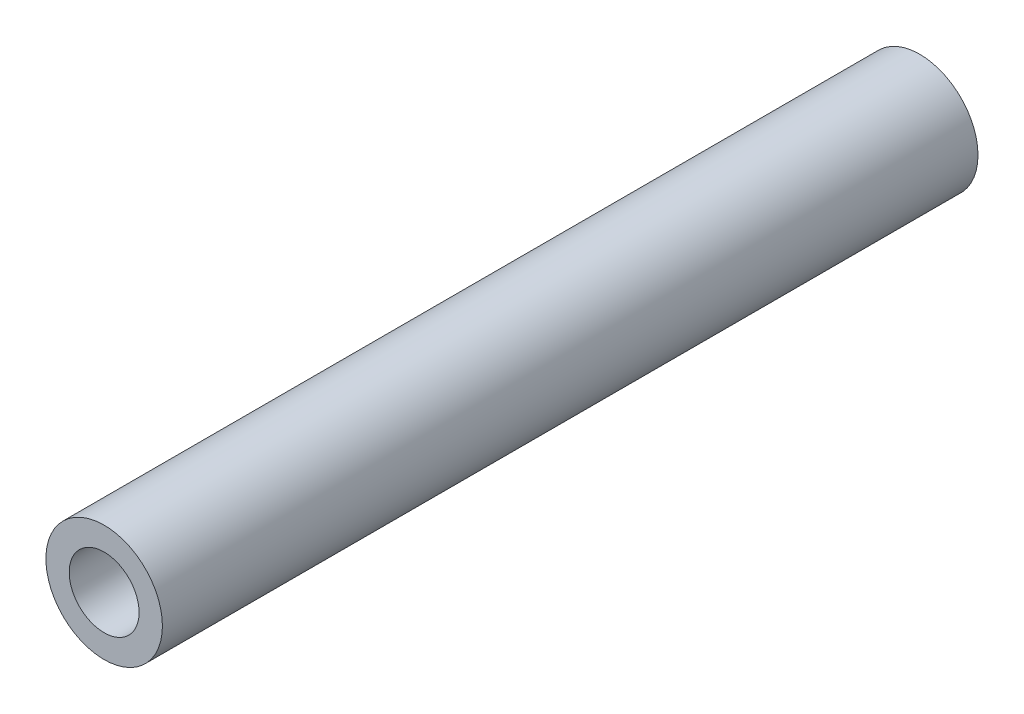
ISO-10303-21;
HEADER;
FILE_DESCRIPTION(('STEP AP214'),'2;1');
FILE_NAME('part.step','',(''),(''),'','','');
FILE_SCHEMA(('AUTOMOTIVE_DESIGN { 1 0 10303 214 1 1 1 1 }'));
ENDSEC;
DATA;
#1=APPLICATION_CONTEXT('core data for automotive mechanical design processes');
#2=APPLICATION_PROTOCOL_DEFINITION('international standard','automotive_design',2000,#1);
#3=PRODUCT_CONTEXT('',#1,'mechanical');
#4=PRODUCT('Part','Part','',(#3));
#5=PRODUCT_RELATED_PRODUCT_CATEGORY('part','',(#4));
#6=PRODUCT_DEFINITION_FORMATION('','',#4);
#7=PRODUCT_DEFINITION_CONTEXT('part definition',#1,'design');
#8=PRODUCT_DEFINITION('design','',#6,#7);
#9=PRODUCT_DEFINITION_SHAPE('','',#8);
#10=(LENGTH_UNIT() NAMED_UNIT(*) SI_UNIT(.MILLI.,.METRE.));
#11=(NAMED_UNIT(*) PLANE_ANGLE_UNIT() SI_UNIT($,.RADIAN.));
#12=(NAMED_UNIT(*) SI_UNIT($,.STERADIAN.) SOLID_ANGLE_UNIT());
#13=UNCERTAINTY_MEASURE_WITH_UNIT(LENGTH_MEASURE(1.E-05),#10,'distance_accuracy_value','');
#14=(GEOMETRIC_REPRESENTATION_CONTEXT(3) GLOBAL_UNCERTAINTY_ASSIGNED_CONTEXT((#13)) GLOBAL_UNIT_ASSIGNED_CONTEXT((#10,
#11,#12)) REPRESENTATION_CONTEXT('',''));
#15=CARTESIAN_POINT('',(0.,0.,0.));
#16=DIRECTION('',(0.,0.,1.));
#17=DIRECTION('',(1.,0.,0.));
#18=AXIS2_PLACEMENT_3D('',#15,#16,#17);
#19=CARTESIAN_POINT('',(0.,0.,7.));
#20=DIRECTION('',(0.,0.,1.));
#21=DIRECTION('',(1.,0.,0.));
#22=AXIS2_PLACEMENT_3D('',#19,#20,#21);
#23=PLANE('',#22);
#24=CARTESIAN_POINT('',(0.,0.,7.));
#25=DIRECTION('',(0.,0.,1.));
#26=DIRECTION('',(1.,0.,0.));
#27=AXIS2_PLACEMENT_3D('',#24,#25,#26);
#28=CIRCLE('',#27,1.);
#29=CARTESIAN_POINT('',(1.,0.,7.));
#30=VERTEX_POINT('',#29);
#31=EDGE_CURVE('E10',#30,#30,#28,.T.);
#32=ORIENTED_EDGE('',*,*,#31,.T.);
#33=EDGE_LOOP('',(#32));
#34=FACE_BOUND('',#33,.T.);
#35=CARTESIAN_POINT('',(0.,0.,7.));
#36=DIRECTION('',(0.,0.,1.));
#37=DIRECTION('',(1.,0.,0.));
#38=AXIS2_PLACEMENT_3D('',#35,#36,#37);
#39=CIRCLE('',#38,0.6);
#40=CARTESIAN_POINT('',(0.6,0.,7.));
#41=VERTEX_POINT('',#40);
#42=EDGE_CURVE('E49',#41,#41,#39,.T.);
#43=ORIENTED_EDGE('',*,*,#42,.F.);
#44=EDGE_LOOP('',(#43));
#45=FACE_BOUND('',#44,.T.);
#46=ADVANCED_FACE('F39',(#34,#45),#23,.T.);
#47=CARTESIAN_POINT('',(0.,0.,-7.));
#48=DIRECTION('',(0.,0.,1.));
#49=DIRECTION('',(1.,0.,0.));
#50=AXIS2_PLACEMENT_3D('',#47,#48,#49);
#51=PLANE('',#50);
#52=CARTESIAN_POINT('',(0.,0.,-7.));
#53=DIRECTION('',(0.,0.,1.));
#54=DIRECTION('',(1.,0.,0.));
#55=AXIS2_PLACEMENT_3D('',#52,#53,#54);
#56=CIRCLE('',#55,1.);
#57=CARTESIAN_POINT('',(1.,0.,-7.));
#58=VERTEX_POINT('',#57);
#59=EDGE_CURVE('E43',#58,#58,#56,.T.);
#60=ORIENTED_EDGE('',*,*,#59,.F.);
#61=EDGE_LOOP('',(#60));
#62=FACE_BOUND('',#61,.T.);
#63=CARTESIAN_POINT('',(0.,0.,-7.));
#64=DIRECTION('',(0.,0.,1.));
#65=DIRECTION('',(1.,0.,0.));
#66=AXIS2_PLACEMENT_3D('',#63,#64,#65);
#67=CIRCLE('',#66,0.6);
#68=CARTESIAN_POINT('',(0.6,0.,-7.));
#69=VERTEX_POINT('',#68);
#70=EDGE_CURVE('E55',#69,#69,#67,.T.);
#71=ORIENTED_EDGE('',*,*,#70,.T.);
#72=EDGE_LOOP('',(#71));
#73=FACE_BOUND('',#72,.T.);
#74=ADVANCED_FACE('F61',(#62,#73),#51,.F.);
#75=CARTESIAN_POINT('',(0.,0.,7.));
#76=DIRECTION('',(0.,0.,-1.));
#77=DIRECTION('',(-1.,0.,0.));
#78=AXIS2_PLACEMENT_3D('',#75,#76,#77);
#79=CYLINDRICAL_SURFACE('',#78,1.);
#80=ORIENTED_EDGE('',*,*,#31,.F.);
#81=EDGE_LOOP('',(#80));
#82=FACE_BOUND('',#81,.T.);
#83=ORIENTED_EDGE('',*,*,#59,.T.);
#84=EDGE_LOOP('',(#83));
#85=FACE_BOUND('',#84,.T.);
#86=ADVANCED_FACE('F41',(#82,#85),#79,.T.);
#87=CARTESIAN_POINT('',(0.,0.,7.));
#88=DIRECTION('',(0.,0.,-1.));
#89=DIRECTION('',(-1.,0.,0.));
#90=AXIS2_PLACEMENT_3D('',#87,#88,#89);
#91=CYLINDRICAL_SURFACE('',#90,0.6);
#92=ORIENTED_EDGE('',*,*,#42,.T.);
#93=EDGE_LOOP('',(#92));
#94=FACE_BOUND('',#93,.T.);
#95=ORIENTED_EDGE('',*,*,#70,.F.);
#96=EDGE_LOOP('',(#95));
#97=FACE_BOUND('',#96,.T.);
#98=ADVANCED_FACE('F59',(#94,#97),#91,.F.);
#99=CLOSED_SHELL('',(#46,#74,#86,#98));
#100=MANIFOLD_SOLID_BREP('B2',#99);
#101=ADVANCED_BREP_SHAPE_REPRESENTATION('',(#18,#100),#14);
#102=SHAPE_DEFINITION_REPRESENTATION(#9,#101);
ENDSEC;
END-ISO-10303-21;
